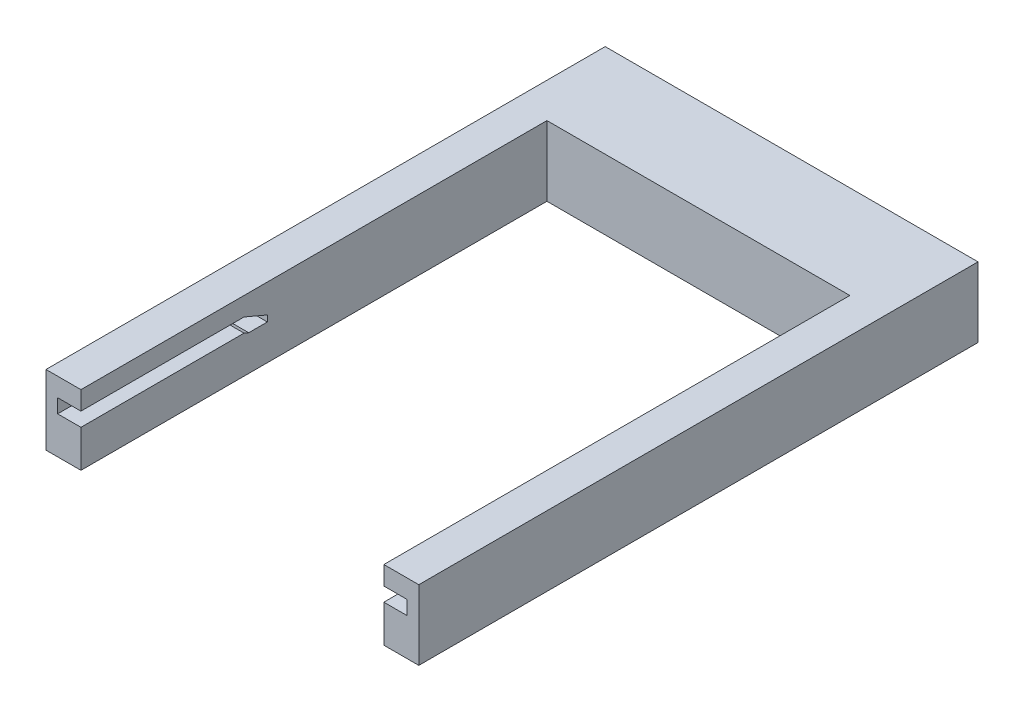
ISO-10303-21;
HEADER;
FILE_DESCRIPTION(('STEP AP214'),'2;1');
FILE_NAME('part.step','',(''),(''),'','','');
FILE_SCHEMA(('AUTOMOTIVE_DESIGN { 1 0 10303 214 1 1 1 1 }'));
ENDSEC;
DATA;
#1=APPLICATION_CONTEXT('core data for automotive mechanical design processes');
#2=APPLICATION_PROTOCOL_DEFINITION('international standard','automotive_design',2000,#1);
#3=PRODUCT_CONTEXT('',#1,'mechanical');
#4=PRODUCT('Part','Part','',(#3));
#5=PRODUCT_RELATED_PRODUCT_CATEGORY('part','',(#4));
#6=PRODUCT_DEFINITION_FORMATION('','',#4);
#7=PRODUCT_DEFINITION_CONTEXT('part definition',#1,'design');
#8=PRODUCT_DEFINITION('design','',#6,#7);
#9=PRODUCT_DEFINITION_SHAPE('','',#8);
#10=(LENGTH_UNIT() NAMED_UNIT(*) SI_UNIT(.MILLI.,.METRE.));
#11=(NAMED_UNIT(*) PLANE_ANGLE_UNIT() SI_UNIT($,.RADIAN.));
#12=(NAMED_UNIT(*) SI_UNIT($,.STERADIAN.) SOLID_ANGLE_UNIT());
#13=UNCERTAINTY_MEASURE_WITH_UNIT(LENGTH_MEASURE(1.E-05),#10,'distance_accuracy_value','');
#14=(GEOMETRIC_REPRESENTATION_CONTEXT(3) GLOBAL_UNCERTAINTY_ASSIGNED_CONTEXT((#13)) GLOBAL_UNIT_ASSIGNED_CONTEXT((#10,
#11,#12)) REPRESENTATION_CONTEXT('',''));
#15=CARTESIAN_POINT('',(0.,0.,0.));
#16=DIRECTION('',(0.,0.,1.));
#17=DIRECTION('',(1.,0.,0.));
#18=AXIS2_PLACEMENT_3D('',#15,#16,#17);
#19=CARTESIAN_POINT('',(40.,15.,-60.));
#20=DIRECTION('',(-1.,0.,0.));
#21=DIRECTION('',(0.,0.,1.));
#22=AXIS2_PLACEMENT_3D('',#19,#20,#21);
#23=PLANE('',#22);
#24=DIRECTION('',(0.,0.,-1.));
#25=VECTOR('',#24,1.);
#26=CARTESIAN_POINT('',(40.,0.,-60.));
#27=LINE('',#26,#25);
#28=CARTESIAN_POINT('',(40.,0.,60.));
#29=VERTEX_POINT('',#28);
#30=CARTESIAN_POINT('',(40.,0.,-60.));
#31=VERTEX_POINT('',#30);
#32=EDGE_CURVE('E260',#29,#31,#27,.T.);
#33=ORIENTED_EDGE('',*,*,#32,.T.);
#34=DIRECTION('',(0.,-1.,0.));
#35=VECTOR('',#34,1.);
#36=CARTESIAN_POINT('',(40.,15.,-60.));
#37=LINE('',#36,#35);
#38=CARTESIAN_POINT('',(40.,15.,-60.));
#39=VERTEX_POINT('',#38);
#40=EDGE_CURVE('E340',#39,#31,#37,.T.);
#41=ORIENTED_EDGE('',*,*,#40,.F.);
#42=DIRECTION('',(0.,0.,-1.));
#43=VECTOR('',#42,1.);
#44=CARTESIAN_POINT('',(40.,15.,-60.));
#45=LINE('',#44,#43);
#46=CARTESIAN_POINT('',(40.,15.,60.));
#47=VERTEX_POINT('',#46);
#48=EDGE_CURVE('E261',#47,#39,#45,.T.);
#49=ORIENTED_EDGE('',*,*,#48,.F.);
#50=DIRECTION('',(0.,-1.,0.));
#51=VECTOR('',#50,1.);
#52=CARTESIAN_POINT('',(40.,15.,60.));
#53=LINE('',#52,#51);
#54=EDGE_CURVE('E287',#47,#29,#53,.T.);
#55=ORIENTED_EDGE('',*,*,#54,.T.);
#56=EDGE_LOOP('',(#33,#41,#49,#55));
#57=FACE_BOUND('',#56,.T.);
#58=ADVANCED_FACE('F43',(#57),#23,.F.);
#59=CARTESIAN_POINT('',(-40.,15.,-60.));
#60=DIRECTION('',(0.,0.,1.));
#61=DIRECTION('',(1.,0.,0.));
#62=AXIS2_PLACEMENT_3D('',#59,#60,#61);
#63=PLANE('',#62);
#64=DIRECTION('',(-1.,0.,0.));
#65=VECTOR('',#64,1.);
#66=CARTESIAN_POINT('',(-40.,0.,-60.));
#67=LINE('',#66,#65);
#68=CARTESIAN_POINT('',(-40.,0.,-60.));
#69=VERTEX_POINT('',#68);
#70=EDGE_CURVE('E291',#31,#69,#67,.T.);
#71=ORIENTED_EDGE('',*,*,#70,.T.);
#72=DIRECTION('',(0.,-1.,0.));
#73=VECTOR('',#72,1.);
#74=CARTESIAN_POINT('',(-40.,15.,-60.));
#75=LINE('',#74,#73);
#76=CARTESIAN_POINT('',(-40.,15.,-60.));
#77=VERTEX_POINT('',#76);
#78=EDGE_CURVE('E336',#77,#69,#75,.T.);
#79=ORIENTED_EDGE('',*,*,#78,.F.);
#80=DIRECTION('',(-1.,0.,0.));
#81=VECTOR('',#80,1.);
#82=CARTESIAN_POINT('',(-40.,15.,-60.));
#83=LINE('',#82,#81);
#84=EDGE_CURVE('E265',#39,#77,#83,.T.);
#85=ORIENTED_EDGE('',*,*,#84,.F.);
#86=ORIENTED_EDGE('',*,*,#40,.T.);
#87=EDGE_LOOP('',(#71,#79,#85,#86));
#88=FACE_BOUND('',#87,.T.);
#89=ADVANCED_FACE('F477',(#88),#63,.F.);
#90=CARTESIAN_POINT('',(-40.,15.,-60.));
#91=DIRECTION('',(1.,0.,0.));
#92=DIRECTION('',(0.,0.,-1.));
#93=AXIS2_PLACEMENT_3D('',#90,#91,#92);
#94=PLANE('',#93);
#95=DIRECTION('',(0.,0.,1.));
#96=VECTOR('',#95,1.);
#97=CARTESIAN_POINT('',(-40.,0.,-60.));
#98=LINE('',#97,#96);
#99=CARTESIAN_POINT('',(-40.,0.,60.));
#100=VERTEX_POINT('',#99);
#101=EDGE_CURVE('E294',#69,#100,#98,.T.);
#102=ORIENTED_EDGE('',*,*,#101,.T.);
#103=DIRECTION('',(0.,-1.,0.));
#104=VECTOR('',#103,1.);
#105=CARTESIAN_POINT('',(-40.,15.,60.));
#106=LINE('',#105,#104);
#107=CARTESIAN_POINT('',(-40.,15.,60.));
#108=VERTEX_POINT('',#107);
#109=EDGE_CURVE('E332',#108,#100,#106,.T.);
#110=ORIENTED_EDGE('',*,*,#109,.F.);
#111=DIRECTION('',(0.,0.,1.));
#112=VECTOR('',#111,1.);
#113=CARTESIAN_POINT('',(-40.,15.,-60.));
#114=LINE('',#113,#112);
#115=EDGE_CURVE('E269',#77,#108,#114,.T.);
#116=ORIENTED_EDGE('',*,*,#115,.F.);
#117=ORIENTED_EDGE('',*,*,#78,.T.);
#118=EDGE_LOOP('',(#102,#110,#116,#117));
#119=FACE_BOUND('',#118,.T.);
#120=ADVANCED_FACE('F479',(#119),#94,.F.);
#121=CARTESIAN_POINT('',(-40.,15.,60.));
#122=DIRECTION('',(0.,0.,-1.));
#123=DIRECTION('',(-1.,0.,0.));
#124=AXIS2_PLACEMENT_3D('',#121,#122,#123);
#125=PLANE('',#124);
#126=DIRECTION('',(0.,-1.,0.));
#127=VECTOR('',#126,1.);
#128=CARTESIAN_POINT('',(-37.5,8.,60.));
#129=LINE('',#128,#127);
#130=CARTESIAN_POINT('',(-37.5,11.,60.));
#131=VERTEX_POINT('',#130);
#132=CARTESIAN_POINT('',(-37.5,8.,60.));
#133=VERTEX_POINT('',#132);
#134=EDGE_CURVE('E201',#131,#133,#129,.T.);
#135=ORIENTED_EDGE('',*,*,#134,.F.);
#136=DIRECTION('',(1.,0.,0.));
#137=VECTOR('',#136,1.);
#138=CARTESIAN_POINT('',(-37.5,11.,60.));
#139=LINE('',#138,#137);
#140=CARTESIAN_POINT('',(-32.5,11.,60.));
#141=VERTEX_POINT('',#140);
#142=EDGE_CURVE('E233',#131,#141,#139,.T.);
#143=ORIENTED_EDGE('',*,*,#142,.T.);
#144=DIRECTION('',(0.,-1.,0.));
#145=VECTOR('',#144,1.);
#146=CARTESIAN_POINT('',(-32.5,15.,60.));
#147=LINE('',#146,#145);
#148=CARTESIAN_POINT('',(-32.5,15.,60.));
#149=VERTEX_POINT('',#148);
#150=EDGE_CURVE('E328',#149,#141,#147,.T.);
#151=ORIENTED_EDGE('',*,*,#150,.F.);
#152=DIRECTION('',(1.,0.,0.));
#153=VECTOR('',#152,1.);
#154=CARTESIAN_POINT('',(-40.,15.,60.));
#155=LINE('',#154,#153);
#156=EDGE_CURVE('E272',#108,#149,#155,.T.);
#157=ORIENTED_EDGE('',*,*,#156,.F.);
#158=ORIENTED_EDGE('',*,*,#109,.T.);
#159=DIRECTION('',(1.,0.,0.));
#160=VECTOR('',#159,1.);
#161=CARTESIAN_POINT('',(-40.,0.,60.));
#162=LINE('',#161,#160);
#163=CARTESIAN_POINT('',(-32.5,0.,60.));
#164=VERTEX_POINT('',#163);
#165=EDGE_CURVE('E297',#100,#164,#162,.T.);
#166=ORIENTED_EDGE('',*,*,#165,.T.);
#167=CARTESIAN_POINT('',(-32.5,8.,60.));
#168=VERTEX_POINT('',#167);
#169=EDGE_CURVE('E217',#168,#164,#147,.T.);
#170=ORIENTED_EDGE('',*,*,#169,.F.);
#171=DIRECTION('',(1.,0.,0.));
#172=VECTOR('',#171,1.);
#173=CARTESIAN_POINT('',(-37.5,8.,60.));
#174=LINE('',#173,#172);
#175=EDGE_CURVE('E58',#133,#168,#174,.T.);
#176=ORIENTED_EDGE('',*,*,#175,.F.);
#177=EDGE_LOOP('',(#135,#143,#151,#157,#158,#166,#170,#176));
#178=FACE_BOUND('',#177,.T.);
#179=ADVANCED_FACE('F215',(#178),#125,.F.);
#180=CARTESIAN_POINT('',(-32.5,15.,-40.));
#181=DIRECTION('',(-1.,0.,0.));
#182=DIRECTION('',(0.,0.,1.));
#183=AXIS2_PLACEMENT_3D('',#180,#181,#182);
#184=PLANE('',#183);
#185=ORIENTED_EDGE('',*,*,#150,.T.);
#186=DIRECTION('',(0.,0.,-1.));
#187=VECTOR('',#186,1.);
#188=CARTESIAN_POINT('',(-32.5,11.,-40.));
#189=LINE('',#188,#187);
#190=CARTESIAN_POINT('',(-32.5,11.,25.));
#191=VERTEX_POINT('',#190);
#192=EDGE_CURVE('E240',#141,#191,#189,.T.);
#193=ORIENTED_EDGE('',*,*,#192,.T.);
#194=DIRECTION('',(0.,-0.390731128489274,-0.92050485345244));
#195=VECTOR('',#194,1.);
#196=CARTESIAN_POINT('',(-32.5,-11.7678602519242,-28.6377174392401));
#197=LINE('',#196,#195);
#198=CARTESIAN_POINT('',(-32.5,8.87762591895197,20.));
#199=VERTEX_POINT('',#198);
#200=EDGE_CURVE('E256',#191,#199,#197,.T.);
#201=ORIENTED_EDGE('',*,*,#200,.T.);
#202=DIRECTION('',(0.,-1.,0.));
#203=VECTOR('',#202,1.);
#204=CARTESIAN_POINT('',(-32.5,15.,20.));
#205=LINE('',#204,#203);
#206=CARTESIAN_POINT('',(-32.5,7.5755251837904,20.));
#207=VERTEX_POINT('',#206);
#208=EDGE_CURVE('E252',#199,#207,#205,.T.);
#209=ORIENTED_EDGE('',*,*,#208,.T.);
#210=DIRECTION('',(0.,0.,1.));
#211=VECTOR('',#210,1.);
#212=CARTESIAN_POINT('',(-32.5,7.57552518379042,-40.));
#213=LINE('',#212,#211);
#214=CARTESIAN_POINT('',(-32.5,7.57552518379039,24.));
#215=VERTEX_POINT('',#214);
#216=EDGE_CURVE('E248',#207,#215,#213,.T.);
#217=ORIENTED_EDGE('',*,*,#216,.T.);
#218=DIRECTION('',(0.,0.390731128489276,0.920504853452439));
#219=VECTOR('',#218,1.);
#220=CARTESIAN_POINT('',(-32.5,-14.3098478076127,-27.558707738732));
#221=LINE('',#220,#219);
#222=CARTESIAN_POINT('',(-32.5,8.,25.));
#223=VERTEX_POINT('',#222);
#224=EDGE_CURVE('E244',#215,#223,#221,.T.);
#225=ORIENTED_EDGE('',*,*,#224,.T.);
#226=DIRECTION('',(0.,0.,1.));
#227=VECTOR('',#226,1.);
#228=CARTESIAN_POINT('',(-32.5,8.00000000000001,-40.));
#229=LINE('',#228,#227);
#230=EDGE_CURVE('E232',#223,#168,#229,.T.);
#231=ORIENTED_EDGE('',*,*,#230,.T.);
#232=ORIENTED_EDGE('',*,*,#169,.T.);
#233=DIRECTION('',(0.,0.,-1.));
#234=VECTOR('',#233,1.);
#235=CARTESIAN_POINT('',(-32.5,0.,-40.));
#236=LINE('',#235,#234);
#237=CARTESIAN_POINT('',(-32.5,0.,-40.));
#238=VERTEX_POINT('',#237);
#239=EDGE_CURVE('E300',#164,#238,#236,.T.);
#240=ORIENTED_EDGE('',*,*,#239,.T.);
#241=DIRECTION('',(0.,-1.,0.));
#242=VECTOR('',#241,1.);
#243=CARTESIAN_POINT('',(-32.5,15.,-40.));
#244=LINE('',#243,#242);
#245=CARTESIAN_POINT('',(-32.5,15.,-40.));
#246=VERTEX_POINT('',#245);
#247=EDGE_CURVE('E324',#246,#238,#244,.T.);
#248=ORIENTED_EDGE('',*,*,#247,.F.);
#249=DIRECTION('',(0.,0.,-1.));
#250=VECTOR('',#249,1.);
#251=CARTESIAN_POINT('',(-32.5,15.,-40.));
#252=LINE('',#251,#250);
#253=EDGE_CURVE('E275',#149,#246,#252,.T.);
#254=ORIENTED_EDGE('',*,*,#253,.F.);
#255=EDGE_LOOP('',(#185,#193,#201,#209,#217,#225,#231,#232,#240,#248,#254));
#256=FACE_BOUND('',#255,.T.);
#257=ADVANCED_FACE('F447',(#256),#184,.F.);
#258=CARTESIAN_POINT('',(-32.5,15.,-40.));
#259=DIRECTION('',(0.,0.,-1.));
#260=DIRECTION('',(-1.,0.,0.));
#261=AXIS2_PLACEMENT_3D('',#258,#259,#260);
#262=PLANE('',#261);
#263=DIRECTION('',(1.,0.,0.));
#264=VECTOR('',#263,1.);
#265=CARTESIAN_POINT('',(-32.5,0.,-40.));
#266=LINE('',#265,#264);
#267=CARTESIAN_POINT('',(32.5,0.,-40.));
#268=VERTEX_POINT('',#267);
#269=EDGE_CURVE('E303',#238,#268,#266,.T.);
#270=ORIENTED_EDGE('',*,*,#269,.T.);
#271=DIRECTION('',(0.,-1.,0.));
#272=VECTOR('',#271,1.);
#273=CARTESIAN_POINT('',(32.5,15.,-40.));
#274=LINE('',#273,#272);
#275=CARTESIAN_POINT('',(32.5,15.,-40.));
#276=VERTEX_POINT('',#275);
#277=EDGE_CURVE('E320',#276,#268,#274,.T.);
#278=ORIENTED_EDGE('',*,*,#277,.F.);
#279=DIRECTION('',(1.,0.,0.));
#280=VECTOR('',#279,1.);
#281=CARTESIAN_POINT('',(-32.5,15.,-40.));
#282=LINE('',#281,#280);
#283=EDGE_CURVE('E278',#246,#276,#282,.T.);
#284=ORIENTED_EDGE('',*,*,#283,.F.);
#285=ORIENTED_EDGE('',*,*,#247,.T.);
#286=EDGE_LOOP('',(#270,#278,#284,#285));
#287=FACE_BOUND('',#286,.T.);
#288=ADVANCED_FACE('F465',(#287),#262,.F.);
#289=CARTESIAN_POINT('',(32.5,15.,-40.));
#290=DIRECTION('',(1.,0.,0.));
#291=DIRECTION('',(0.,0.,-1.));
#292=AXIS2_PLACEMENT_3D('',#289,#290,#291);
#293=PLANE('',#292);
#294=DIRECTION('',(0.,0.390731128489274,0.92050485345244));
#295=VECTOR('',#294,1.);
#296=CARTESIAN_POINT('',(32.5,-11.7678602519242,-28.6377174392401));
#297=LINE('',#296,#295);
#298=CARTESIAN_POINT('',(32.5,8.87762591895197,20.));
#299=VERTEX_POINT('',#298);
#300=CARTESIAN_POINT('',(32.5,11.,25.));
#301=VERTEX_POINT('',#300);
#302=EDGE_CURVE('E11',#299,#301,#297,.T.);
#303=ORIENTED_EDGE('',*,*,#302,.T.);
#304=DIRECTION('',(0.,0.,1.));
#305=VECTOR('',#304,1.);
#306=CARTESIAN_POINT('',(32.5,11.,-40.));
#307=LINE('',#306,#305);
#308=CARTESIAN_POINT('',(32.5,11.,60.));
#309=VERTEX_POINT('',#308);
#310=EDGE_CURVE('E236',#301,#309,#307,.T.);
#311=ORIENTED_EDGE('',*,*,#310,.T.);
#312=DIRECTION('',(0.,-1.,0.));
#313=VECTOR('',#312,1.);
#314=CARTESIAN_POINT('',(32.5,15.,60.));
#315=LINE('',#314,#313);
#316=CARTESIAN_POINT('',(32.5,15.,60.));
#317=VERTEX_POINT('',#316);
#318=EDGE_CURVE('E316',#317,#309,#315,.T.);
#319=ORIENTED_EDGE('',*,*,#318,.F.);
#320=DIRECTION('',(0.,0.,1.));
#321=VECTOR('',#320,1.);
#322=CARTESIAN_POINT('',(32.5,15.,-40.));
#323=LINE('',#322,#321);
#324=EDGE_CURVE('E281',#276,#317,#323,.T.);
#325=ORIENTED_EDGE('',*,*,#324,.F.);
#326=ORIENTED_EDGE('',*,*,#277,.T.);
#327=DIRECTION('',(0.,0.,1.));
#328=VECTOR('',#327,1.);
#329=CARTESIAN_POINT('',(32.5,0.,-40.));
#330=LINE('',#329,#328);
#331=CARTESIAN_POINT('',(32.5,0.,60.));
#332=VERTEX_POINT('',#331);
#333=EDGE_CURVE('E306',#268,#332,#330,.T.);
#334=ORIENTED_EDGE('',*,*,#333,.T.);
#335=CARTESIAN_POINT('',(32.5,8.,60.));
#336=VERTEX_POINT('',#335);
#337=EDGE_CURVE('E315',#336,#332,#315,.T.);
#338=ORIENTED_EDGE('',*,*,#337,.F.);
#339=DIRECTION('',(0.,0.,-1.));
#340=VECTOR('',#339,1.);
#341=CARTESIAN_POINT('',(32.5,8.00000000000001,-40.));
#342=LINE('',#341,#340);
#343=CARTESIAN_POINT('',(32.5,8.,25.));
#344=VERTEX_POINT('',#343);
#345=EDGE_CURVE('E228',#336,#344,#342,.T.);
#346=ORIENTED_EDGE('',*,*,#345,.T.);
#347=DIRECTION('',(0.,-0.390731128489276,-0.920504853452439));
#348=VECTOR('',#347,1.);
#349=CARTESIAN_POINT('',(32.5,-14.3098478076127,-27.558707738732));
#350=LINE('',#349,#348);
#351=CARTESIAN_POINT('',(32.5,7.57552518379039,24.));
#352=VERTEX_POINT('',#351);
#353=EDGE_CURVE('E352',#344,#352,#350,.T.);
#354=ORIENTED_EDGE('',*,*,#353,.T.);
#355=DIRECTION('',(0.,0.,-1.));
#356=VECTOR('',#355,1.);
#357=CARTESIAN_POINT('',(32.5,7.57552518379042,-40.));
#358=LINE('',#357,#356);
#359=CARTESIAN_POINT('',(32.5,7.5755251837904,20.));
#360=VERTEX_POINT('',#359);
#361=EDGE_CURVE('E356',#352,#360,#358,.T.);
#362=ORIENTED_EDGE('',*,*,#361,.T.);
#363=DIRECTION('',(0.,1.,0.));
#364=VECTOR('',#363,1.);
#365=CARTESIAN_POINT('',(32.5,15.,20.));
#366=LINE('',#365,#364);
#367=EDGE_CURVE('E51',#360,#299,#366,.T.);
#368=ORIENTED_EDGE('',*,*,#367,.T.);
#369=EDGE_LOOP('',(#303,#311,#319,#325,#326,#334,#338,#346,#354,#362,#368));
#370=FACE_BOUND('',#369,.T.);
#371=ADVANCED_FACE('F362',(#370),#293,.F.);
#372=CARTESIAN_POINT('',(32.5,15.,60.));
#373=DIRECTION('',(0.,0.,-1.));
#374=DIRECTION('',(-1.,0.,0.));
#375=AXIS2_PLACEMENT_3D('',#372,#373,#374);
#376=PLANE('',#375);
#377=ORIENTED_EDGE('',*,*,#318,.T.);
#378=DIRECTION('',(1.,0.,0.));
#379=VECTOR('',#378,1.);
#380=CARTESIAN_POINT('',(32.5,11.,60.));
#381=LINE('',#380,#379);
#382=CARTESIAN_POINT('',(37.5,11.,60.));
#383=VERTEX_POINT('',#382);
#384=EDGE_CURVE('E348',#309,#383,#381,.T.);
#385=ORIENTED_EDGE('',*,*,#384,.T.);
#386=DIRECTION('',(0.,-1.,0.));
#387=VECTOR('',#386,1.);
#388=CARTESIAN_POINT('',(37.5,8.,60.));
#389=LINE('',#388,#387);
#390=CARTESIAN_POINT('',(37.5,8.,60.));
#391=VERTEX_POINT('',#390);
#392=EDGE_CURVE('E416',#383,#391,#389,.T.);
#393=ORIENTED_EDGE('',*,*,#392,.T.);
#394=DIRECTION('',(-1.,0.,0.));
#395=VECTOR('',#394,1.);
#396=CARTESIAN_POINT('',(32.5,8.,60.));
#397=LINE('',#396,#395);
#398=EDGE_CURVE('E344',#391,#336,#397,.T.);
#399=ORIENTED_EDGE('',*,*,#398,.T.);
#400=ORIENTED_EDGE('',*,*,#337,.T.);
#401=DIRECTION('',(1.,0.,0.));
#402=VECTOR('',#401,1.);
#403=CARTESIAN_POINT('',(32.5,0.,60.));
#404=LINE('',#403,#402);
#405=EDGE_CURVE('E266',#332,#29,#404,.T.);
#406=ORIENTED_EDGE('',*,*,#405,.T.);
#407=ORIENTED_EDGE('',*,*,#54,.F.);
#408=DIRECTION('',(1.,0.,0.));
#409=VECTOR('',#408,1.);
#410=CARTESIAN_POINT('',(32.5,15.,60.));
#411=LINE('',#410,#409);
#412=EDGE_CURVE('E284',#317,#47,#411,.T.);
#413=ORIENTED_EDGE('',*,*,#412,.F.);
#414=EDGE_LOOP('',(#377,#385,#393,#399,#400,#406,#407,#413));
#415=FACE_BOUND('',#414,.T.);
#416=ADVANCED_FACE('F473',(#415),#376,.F.);
#417=CARTESIAN_POINT('',(0.,15.,0.));
#418=DIRECTION('',(0.,1.,0.));
#419=DIRECTION('',(0.,0.,1.));
#420=AXIS2_PLACEMENT_3D('',#417,#418,#419);
#421=PLANE('',#420);
#422=ORIENTED_EDGE('',*,*,#48,.T.);
#423=ORIENTED_EDGE('',*,*,#84,.T.);
#424=ORIENTED_EDGE('',*,*,#115,.T.);
#425=ORIENTED_EDGE('',*,*,#156,.T.);
#426=ORIENTED_EDGE('',*,*,#253,.T.);
#427=ORIENTED_EDGE('',*,*,#283,.T.);
#428=ORIENTED_EDGE('',*,*,#324,.T.);
#429=ORIENTED_EDGE('',*,*,#412,.T.);
#430=EDGE_LOOP('',(#422,#423,#424,#425,#426,#427,#428,#429));
#431=FACE_BOUND('',#430,.T.);
#432=ADVANCED_FACE('F451',(#431),#421,.T.);
#433=CARTESIAN_POINT('',(0.,0.,0.));
#434=DIRECTION('',(0.,1.,0.));
#435=DIRECTION('',(0.,0.,1.));
#436=AXIS2_PLACEMENT_3D('',#433,#434,#435);
#437=PLANE('',#436);
#438=ORIENTED_EDGE('',*,*,#32,.F.);
#439=ORIENTED_EDGE('',*,*,#405,.F.);
#440=ORIENTED_EDGE('',*,*,#333,.F.);
#441=ORIENTED_EDGE('',*,*,#269,.F.);
#442=ORIENTED_EDGE('',*,*,#239,.F.);
#443=ORIENTED_EDGE('',*,*,#165,.F.);
#444=ORIENTED_EDGE('',*,*,#101,.F.);
#445=ORIENTED_EDGE('',*,*,#70,.F.);
#446=EDGE_LOOP('',(#438,#439,#440,#441,#442,#443,#444,#445));
#447=FACE_BOUND('',#446,.T.);
#448=ADVANCED_FACE('F461',(#447),#437,.F.);
#449=CARTESIAN_POINT('',(37.5,0.,0.));
#450=DIRECTION('',(-1.,0.,0.));
#451=DIRECTION('',(0.,0.,1.));
#452=AXIS2_PLACEMENT_3D('',#449,#450,#451);
#453=PLANE('',#452);
#454=ORIENTED_EDGE('',*,*,#392,.F.);
#455=DIRECTION('',(0.,0.,1.));
#456=VECTOR('',#455,1.);
#457=CARTESIAN_POINT('',(37.5,11.,60.));
#458=LINE('',#457,#456);
#459=CARTESIAN_POINT('',(37.5,11.,25.));
#460=VERTEX_POINT('',#459);
#461=EDGE_CURVE('E212',#460,#383,#458,.T.);
#462=ORIENTED_EDGE('',*,*,#461,.F.);
#463=DIRECTION('',(0.,0.390731128489274,0.92050485345244));
#464=VECTOR('',#463,1.);
#465=CARTESIAN_POINT('',(37.5,11.,25.));
#466=LINE('',#465,#464);
#467=CARTESIAN_POINT('',(37.5,8.87762591895197,20.));
#468=VERTEX_POINT('',#467);
#469=EDGE_CURVE('E401',#468,#460,#466,.T.);
#470=ORIENTED_EDGE('',*,*,#469,.F.);
#471=DIRECTION('',(0.,1.,0.));
#472=VECTOR('',#471,1.);
#473=CARTESIAN_POINT('',(37.5,8.87762591895197,20.));
#474=LINE('',#473,#472);
#475=CARTESIAN_POINT('',(37.5,7.5755251837904,20.));
#476=VERTEX_POINT('',#475);
#477=EDGE_CURVE('E405',#476,#468,#474,.T.);
#478=ORIENTED_EDGE('',*,*,#477,.F.);
#479=DIRECTION('',(0.,0.,-1.));
#480=VECTOR('',#479,1.);
#481=CARTESIAN_POINT('',(37.5,7.5755251837904,20.));
#482=LINE('',#481,#480);
#483=CARTESIAN_POINT('',(37.5,7.57552518379039,24.));
#484=VERTEX_POINT('',#483);
#485=EDGE_CURVE('E376',#484,#476,#482,.T.);
#486=ORIENTED_EDGE('',*,*,#485,.F.);
#487=DIRECTION('',(0.,-0.390731128489276,-0.920504853452439));
#488=VECTOR('',#487,1.);
#489=CARTESIAN_POINT('',(37.5,7.57552518379039,24.));
#490=LINE('',#489,#488);
#491=CARTESIAN_POINT('',(37.5,8.,25.));
#492=VERTEX_POINT('',#491);
#493=EDGE_CURVE('E410',#492,#484,#490,.T.);
#494=ORIENTED_EDGE('',*,*,#493,.F.);
#495=DIRECTION('',(0.,0.,-1.));
#496=VECTOR('',#495,1.);
#497=CARTESIAN_POINT('',(37.5,8.,25.));
#498=LINE('',#497,#496);
#499=EDGE_CURVE('E66',#391,#492,#498,.T.);
#500=ORIENTED_EDGE('',*,*,#499,.F.);
#501=EDGE_LOOP('',(#454,#462,#470,#478,#486,#494,#500));
#502=FACE_BOUND('',#501,.T.);
#503=ADVANCED_FACE('F534',(#502),#453,.T.);
#504=CARTESIAN_POINT('',(-37.5,8.,25.));
#505=DIRECTION('',(0.,-1.,0.));
#506=DIRECTION('',(0.,0.,-1.));
#507=AXIS2_PLACEMENT_3D('',#504,#505,#506);
#508=PLANE('',#507);
#509=ORIENTED_EDGE('',*,*,#398,.F.);
#510=ORIENTED_EDGE('',*,*,#499,.T.);
#511=DIRECTION('',(1.,0.,0.));
#512=VECTOR('',#511,1.);
#513=CARTESIAN_POINT('',(-37.5,8.,25.));
#514=LINE('',#513,#512);
#515=EDGE_CURVE('E219',#344,#492,#514,.T.);
#516=ORIENTED_EDGE('',*,*,#515,.F.);
#517=ORIENTED_EDGE('',*,*,#345,.F.);
#518=EDGE_LOOP('',(#509,#510,#516,#517));
#519=FACE_BOUND('',#518,.T.);
#520=ADVANCED_FACE('F571',(#519),#508,.F.);
#521=CARTESIAN_POINT('',(-37.5,11.,60.));
#522=DIRECTION('',(0.,1.,0.));
#523=DIRECTION('',(0.,0.,1.));
#524=AXIS2_PLACEMENT_3D('',#521,#522,#523);
#525=PLANE('',#524);
#526=DIRECTION('',(1.,0.,0.));
#527=VECTOR('',#526,1.);
#528=CARTESIAN_POINT('',(-37.5,11.,25.));
#529=LINE('',#528,#527);
#530=EDGE_CURVE('E391',#301,#460,#529,.T.);
#531=ORIENTED_EDGE('',*,*,#530,.T.);
#532=ORIENTED_EDGE('',*,*,#461,.T.);
#533=ORIENTED_EDGE('',*,*,#384,.F.);
#534=ORIENTED_EDGE('',*,*,#310,.F.);
#535=EDGE_LOOP('',(#531,#532,#533,#534));
#536=FACE_BOUND('',#535,.T.);
#537=ADVANCED_FACE('F581',(#536),#525,.F.);
#538=CARTESIAN_POINT('',(-37.5,7.57552518379039,24.));
#539=DIRECTION('',(0.,-0.920504853452439,0.390731128489276));
#540=DIRECTION('',(0.,-0.390731128489276,-0.920504853452439));
#541=AXIS2_PLACEMENT_3D('',#538,#539,#540);
#542=PLANE('',#541);
#543=ORIENTED_EDGE('',*,*,#515,.T.);
#544=ORIENTED_EDGE('',*,*,#493,.T.);
#545=DIRECTION('',(1.,0.,0.));
#546=VECTOR('',#545,1.);
#547=CARTESIAN_POINT('',(-37.5,7.57552518379039,24.));
#548=LINE('',#547,#546);
#549=EDGE_CURVE('E385',#352,#484,#548,.T.);
#550=ORIENTED_EDGE('',*,*,#549,.F.);
#551=ORIENTED_EDGE('',*,*,#353,.F.);
#552=EDGE_LOOP('',(#543,#544,#550,#551));
#553=FACE_BOUND('',#552,.T.);
#554=ADVANCED_FACE('F592',(#553),#542,.F.);
#555=CARTESIAN_POINT('',(-37.5,7.5755251837904,20.));
#556=DIRECTION('',(0.,-1.,0.));
#557=DIRECTION('',(0.,0.,-1.));
#558=AXIS2_PLACEMENT_3D('',#555,#556,#557);
#559=PLANE('',#558);
#560=ORIENTED_EDGE('',*,*,#549,.T.);
#561=ORIENTED_EDGE('',*,*,#485,.T.);
#562=DIRECTION('',(1.,0.,0.));
#563=VECTOR('',#562,1.);
#564=CARTESIAN_POINT('',(-37.5,7.5755251837904,20.));
#565=LINE('',#564,#563);
#566=EDGE_CURVE('E368',#360,#476,#565,.T.);
#567=ORIENTED_EDGE('',*,*,#566,.F.);
#568=ORIENTED_EDGE('',*,*,#361,.F.);
#569=EDGE_LOOP('',(#560,#561,#567,#568));
#570=FACE_BOUND('',#569,.T.);
#571=ADVANCED_FACE('F373',(#570),#559,.F.);
#572=CARTESIAN_POINT('',(-37.5,8.87762591895197,20.));
#573=DIRECTION('',(0.,0.,-1.));
#574=DIRECTION('',(-1.,0.,0.));
#575=AXIS2_PLACEMENT_3D('',#572,#573,#574);
#576=PLANE('',#575);
#577=ORIENTED_EDGE('',*,*,#566,.T.);
#578=ORIENTED_EDGE('',*,*,#477,.T.);
#579=DIRECTION('',(1.,0.,0.));
#580=VECTOR('',#579,1.);
#581=CARTESIAN_POINT('',(-37.5,8.87762591895197,20.));
#582=LINE('',#581,#580);
#583=EDGE_CURVE('E370',#299,#468,#582,.T.);
#584=ORIENTED_EDGE('',*,*,#583,.F.);
#585=ORIENTED_EDGE('',*,*,#367,.F.);
#586=EDGE_LOOP('',(#577,#578,#584,#585));
#587=FACE_BOUND('',#586,.T.);
#588=ADVANCED_FACE('F366',(#587),#576,.F.);
#589=CARTESIAN_POINT('',(-37.5,11.,25.));
#590=DIRECTION('',(0.,0.92050485345244,-0.390731128489274));
#591=DIRECTION('',(0.,0.390731128489274,0.92050485345244));
#592=AXIS2_PLACEMENT_3D('',#589,#590,#591);
#593=PLANE('',#592);
#594=ORIENTED_EDGE('',*,*,#583,.T.);
#595=ORIENTED_EDGE('',*,*,#469,.T.);
#596=ORIENTED_EDGE('',*,*,#530,.F.);
#597=ORIENTED_EDGE('',*,*,#302,.F.);
#598=EDGE_LOOP('',(#594,#595,#596,#597));
#599=FACE_BOUND('',#598,.T.);
#600=ADVANCED_FACE('F622',(#599),#593,.F.);
#601=CARTESIAN_POINT('',(-37.5,11.,25.));
#602=VERTEX_POINT('',#601);
#603=EDGE_CURVE('E392',#602,#191,#529,.T.);
#604=ORIENTED_EDGE('',*,*,#603,.F.);
#605=DIRECTION('',(0.,0.390731128489274,0.92050485345244));
#606=VECTOR('',#605,1.);
#607=CARTESIAN_POINT('',(-37.5,11.,25.));
#608=LINE('',#607,#606);
#609=CARTESIAN_POINT('',(-37.5,8.87762591895197,20.));
#610=VERTEX_POINT('',#609);
#611=EDGE_CURVE('E224',#610,#602,#608,.T.);
#612=ORIENTED_EDGE('',*,*,#611,.F.);
#613=EDGE_CURVE('E387',#610,#199,#582,.T.);
#614=ORIENTED_EDGE('',*,*,#613,.T.);
#615=ORIENTED_EDGE('',*,*,#200,.F.);
#616=EDGE_LOOP('',(#604,#612,#614,#615));
#617=FACE_BOUND('',#616,.T.);
#618=ADVANCED_FACE('F632',(#617),#593,.F.);
#619=ORIENTED_EDGE('',*,*,#613,.F.);
#620=DIRECTION('',(0.,1.,0.));
#621=VECTOR('',#620,1.);
#622=CARTESIAN_POINT('',(-37.5,8.87762591895197,20.));
#623=LINE('',#622,#621);
#624=CARTESIAN_POINT('',(-37.5,7.5755251837904,20.));
#625=VERTEX_POINT('',#624);
#626=EDGE_CURVE('E422',#625,#610,#623,.T.);
#627=ORIENTED_EDGE('',*,*,#626,.F.);
#628=EDGE_CURVE('E378',#625,#207,#565,.T.);
#629=ORIENTED_EDGE('',*,*,#628,.T.);
#630=ORIENTED_EDGE('',*,*,#208,.F.);
#631=EDGE_LOOP('',(#619,#627,#629,#630));
#632=FACE_BOUND('',#631,.T.);
#633=ADVANCED_FACE('F438',(#632),#576,.F.);
#634=ORIENTED_EDGE('',*,*,#628,.F.);
#635=DIRECTION('',(0.,0.,-1.));
#636=VECTOR('',#635,1.);
#637=CARTESIAN_POINT('',(-37.5,7.5755251837904,20.));
#638=LINE('',#637,#636);
#639=CARTESIAN_POINT('',(-37.5,7.57552518379039,24.));
#640=VERTEX_POINT('',#639);
#641=EDGE_CURVE('E426',#640,#625,#638,.T.);
#642=ORIENTED_EDGE('',*,*,#641,.F.);
#643=EDGE_CURVE('E379',#640,#215,#548,.T.);
#644=ORIENTED_EDGE('',*,*,#643,.T.);
#645=ORIENTED_EDGE('',*,*,#216,.F.);
#646=EDGE_LOOP('',(#634,#642,#644,#645));
#647=FACE_BOUND('',#646,.T.);
#648=ADVANCED_FACE('F435',(#647),#559,.F.);
#649=ORIENTED_EDGE('',*,*,#643,.F.);
#650=DIRECTION('',(0.,-0.390731128489276,-0.920504853452439));
#651=VECTOR('',#650,1.);
#652=CARTESIAN_POINT('',(-37.5,7.57552518379039,24.));
#653=LINE('',#652,#651);
#654=CARTESIAN_POINT('',(-37.5,8.,25.));
#655=VERTEX_POINT('',#654);
#656=EDGE_CURVE('E200',#655,#640,#653,.T.);
#657=ORIENTED_EDGE('',*,*,#656,.F.);
#658=EDGE_CURVE('E195',#655,#223,#514,.T.);
#659=ORIENTED_EDGE('',*,*,#658,.T.);
#660=ORIENTED_EDGE('',*,*,#224,.F.);
#661=EDGE_LOOP('',(#649,#657,#659,#660));
#662=FACE_BOUND('',#661,.T.);
#663=ADVANCED_FACE('F433',(#662),#542,.F.);
#664=ORIENTED_EDGE('',*,*,#142,.F.);
#665=DIRECTION('',(0.,0.,1.));
#666=VECTOR('',#665,1.);
#667=CARTESIAN_POINT('',(-37.5,11.,60.));
#668=LINE('',#667,#666);
#669=EDGE_CURVE('E208',#602,#131,#668,.T.);
#670=ORIENTED_EDGE('',*,*,#669,.F.);
#671=ORIENTED_EDGE('',*,*,#603,.T.);
#672=ORIENTED_EDGE('',*,*,#192,.F.);
#673=EDGE_LOOP('',(#664,#670,#671,#672));
#674=FACE_BOUND('',#673,.T.);
#675=ADVANCED_FACE('F442',(#674),#525,.F.);
#676=ORIENTED_EDGE('',*,*,#658,.F.);
#677=DIRECTION('',(0.,0.,-1.));
#678=VECTOR('',#677,1.);
#679=CARTESIAN_POINT('',(-37.5,8.,25.));
#680=LINE('',#679,#678);
#681=EDGE_CURVE('E191',#133,#655,#680,.T.);
#682=ORIENTED_EDGE('',*,*,#681,.F.);
#683=ORIENTED_EDGE('',*,*,#175,.T.);
#684=ORIENTED_EDGE('',*,*,#230,.F.);
#685=EDGE_LOOP('',(#676,#682,#683,#684));
#686=FACE_BOUND('',#685,.T.);
#687=ADVANCED_FACE('F193',(#686),#508,.F.);
#688=CARTESIAN_POINT('',(-37.5,0.,0.));
#689=DIRECTION('',(-1.,0.,0.));
#690=DIRECTION('',(0.,0.,1.));
#691=AXIS2_PLACEMENT_3D('',#688,#689,#690);
#692=PLANE('',#691);
#693=ORIENTED_EDGE('',*,*,#134,.T.);
#694=ORIENTED_EDGE('',*,*,#681,.T.);
#695=ORIENTED_EDGE('',*,*,#656,.T.);
#696=ORIENTED_EDGE('',*,*,#641,.T.);
#697=ORIENTED_EDGE('',*,*,#626,.T.);
#698=ORIENTED_EDGE('',*,*,#611,.T.);
#699=ORIENTED_EDGE('',*,*,#669,.T.);
#700=EDGE_LOOP('',(#693,#694,#695,#696,#697,#698,#699));
#701=FACE_BOUND('',#700,.T.);
#702=ADVANCED_FACE('F205',(#701),#692,.F.);
#703=CLOSED_SHELL('',(#58,#89,#120,#179,#257,#288,#371,#416,#432,#448,#503,#520,#537,#554,#571,
#588,#600,#618,#633,#648,#663,#675,#687,#702));
#704=MANIFOLD_SOLID_BREP('B2',#703);
#705=ADVANCED_BREP_SHAPE_REPRESENTATION('',(#18,#704),#14);
#706=SHAPE_DEFINITION_REPRESENTATION(#9,#705);
ENDSEC;
END-ISO-10303-21;
